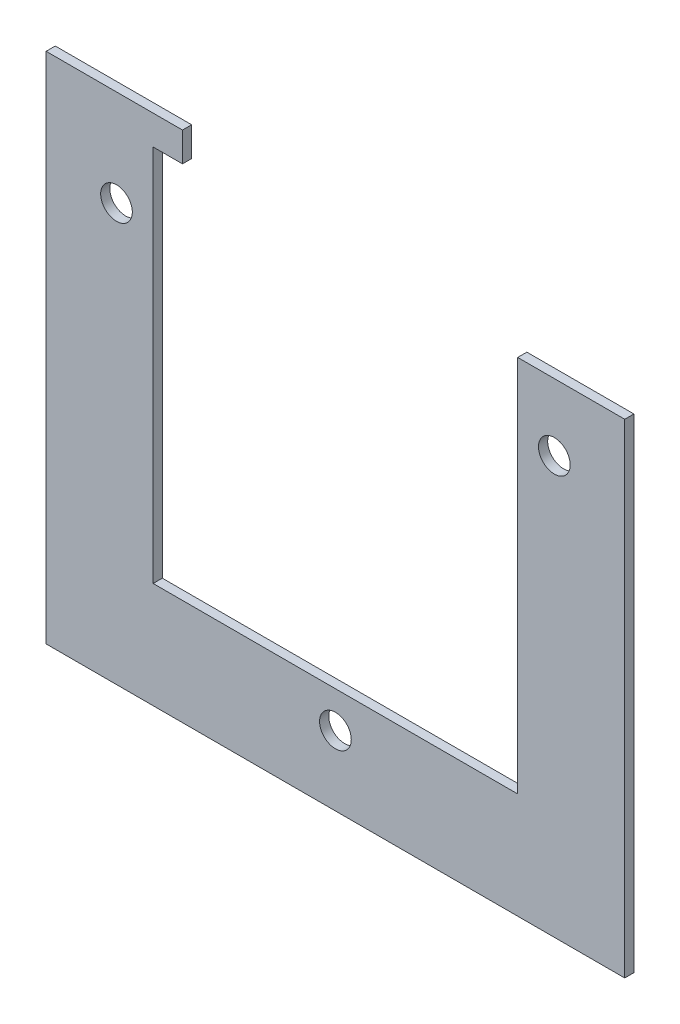
ISO-10303-21;
HEADER;
FILE_DESCRIPTION(('STEP AP214'),'2;1');
FILE_NAME('part.step','',(''),(''),'','','');
FILE_SCHEMA(('AUTOMOTIVE_DESIGN { 1 0 10303 214 1 1 1 1 }'));
ENDSEC;
DATA;
#1=APPLICATION_CONTEXT('core data for automotive mechanical design processes');
#2=APPLICATION_PROTOCOL_DEFINITION('international standard','automotive_design',2000,#1);
#3=PRODUCT_CONTEXT('',#1,'mechanical');
#4=PRODUCT('Part','Part','',(#3));
#5=PRODUCT_RELATED_PRODUCT_CATEGORY('part','',(#4));
#6=PRODUCT_DEFINITION_FORMATION('','',#4);
#7=PRODUCT_DEFINITION_CONTEXT('part definition',#1,'design');
#8=PRODUCT_DEFINITION('design','',#6,#7);
#9=PRODUCT_DEFINITION_SHAPE('','',#8);
#10=(LENGTH_UNIT() NAMED_UNIT(*) SI_UNIT(.MILLI.,.METRE.));
#11=(NAMED_UNIT(*) PLANE_ANGLE_UNIT() SI_UNIT($,.RADIAN.));
#12=(NAMED_UNIT(*) SI_UNIT($,.STERADIAN.) SOLID_ANGLE_UNIT());
#13=UNCERTAINTY_MEASURE_WITH_UNIT(LENGTH_MEASURE(1.E-05),#10,'distance_accuracy_value','');
#14=(GEOMETRIC_REPRESENTATION_CONTEXT(3) GLOBAL_UNCERTAINTY_ASSIGNED_CONTEXT((#13)) GLOBAL_UNIT_ASSIGNED_CONTEXT((#10,
#11,#12)) REPRESENTATION_CONTEXT('',''));
#15=CARTESIAN_POINT('',(0.,0.,0.));
#16=DIRECTION('',(0.,0.,1.));
#17=DIRECTION('',(1.,0.,0.));
#18=AXIS2_PLACEMENT_3D('',#15,#16,#17);
#19=CARTESIAN_POINT('',(0.,0.,-0.79375));
#20=DIRECTION('',(0.,0.,1.));
#21=DIRECTION('',(-1.,0.,0.));
#22=AXIS2_PLACEMENT_3D('',#19,#20,#21);
#23=PLANE('',#22);
#24=CARTESIAN_POINT('',(7523.2575610023,3421.82109597681,-0.79375));
#25=DIRECTION('',(0.,0.,1.));
#26=DIRECTION('',(1.,0.,0.));
#27=AXIS2_PLACEMENT_3D('',#24,#25,#26);
#28=CIRCLE('',#27,1.3715999999997);
#29=CARTESIAN_POINT('',(7524.6291610023,3421.82109597681,-0.79375));
#30=VERTEX_POINT('',#29);
#31=EDGE_CURVE('E362',#30,#30,#28,.T.);
#32=ORIENTED_EDGE('',*,*,#31,.T.);
#33=EDGE_LOOP('',(#32));
#34=FACE_BOUND('',#33,.T.);
#35=DIRECTION('',(0.,-1.,0.));
#36=VECTOR('',#35,1.);
#37=CARTESIAN_POINT('',(7520.0825610023,3427.61229597682,-0.79375));
#38=LINE('',#37,#36);
#39=CARTESIAN_POINT('',(7520.0825610023,3427.61229597682,-0.79375));
#40=VERTEX_POINT('',#39);
#41=CARTESIAN_POINT('',(7520.0825610023,3394.87169597682,-0.79375));
#42=VERTEX_POINT('',#41);
#43=EDGE_CURVE('E170',#40,#42,#38,.T.);
#44=ORIENTED_EDGE('',*,*,#43,.F.);
#45=DIRECTION('',(-1.,0.,0.));
#46=VECTOR('',#45,1.);
#47=CARTESIAN_POINT('',(7520.0825610023,3427.61229597682,-0.79375));
#48=LINE('',#47,#46);
#49=CARTESIAN_POINT('',(7529.3535610023,3427.61229597682,-0.79375));
#50=VERTEX_POINT('',#49);
#51=EDGE_CURVE('E138',#50,#40,#48,.T.);
#52=ORIENTED_EDGE('',*,*,#51,.F.);
#53=DIRECTION('',(0.,1.,0.));
#54=VECTOR('',#53,1.);
#55=CARTESIAN_POINT('',(7529.3535610023,3427.61229597682,-0.79375));
#56=LINE('',#55,#54);
#57=CARTESIAN_POINT('',(7529.3535610023,3385.70229597682,-0.79375));
#58=VERTEX_POINT('',#57);
#59=EDGE_CURVE('E119',#58,#50,#56,.T.);
#60=ORIENTED_EDGE('',*,*,#59,.F.);
#61=DIRECTION('',(1.,0.,0.));
#62=VECTOR('',#61,1.);
#63=CARTESIAN_POINT('',(7529.3535610023,3385.70229597682,-0.79375));
#64=LINE('',#63,#62);
#65=CARTESIAN_POINT('',(7479.2393610023,3385.70229597682,-0.79375));
#66=VERTEX_POINT('',#65);
#67=EDGE_CURVE('E129',#66,#58,#64,.T.);
#68=ORIENTED_EDGE('',*,*,#67,.F.);
#69=DIRECTION('',(0.,-1.,0.));
#70=VECTOR('',#69,1.);
#71=CARTESIAN_POINT('',(7479.2393610023,3430.15229597682,-0.79375));
#72=LINE('',#71,#70);
#73=CARTESIAN_POINT('',(7479.2393610023,3430.15229597682,-0.79375));
#74=VERTEX_POINT('',#73);
#75=EDGE_CURVE('E134',#74,#66,#72,.T.);
#76=ORIENTED_EDGE('',*,*,#75,.F.);
#77=DIRECTION('',(-1.,0.,0.));
#78=VECTOR('',#77,1.);
#79=CARTESIAN_POINT('',(7479.2393610023,3430.15229597682,-0.79375));
#80=LINE('',#79,#78);
#81=CARTESIAN_POINT('',(7491.0503610023,3430.15229597682,-0.79375));
#82=VERTEX_POINT('',#81);
#83=EDGE_CURVE('E206',#82,#74,#80,.T.);
#84=ORIENTED_EDGE('',*,*,#83,.F.);
#85=DIRECTION('',(0.,1.,0.));
#86=VECTOR('',#85,1.);
#87=CARTESIAN_POINT('',(7491.0503610023,3427.61229597682,-0.79375));
#88=LINE('',#87,#86);
#89=CARTESIAN_POINT('',(7491.0503610023,3427.61229597682,-0.79375));
#90=VERTEX_POINT('',#89);
#91=EDGE_CURVE('E203',#90,#82,#88,.T.);
#92=ORIENTED_EDGE('',*,*,#91,.F.);
#93=DIRECTION('',(1.,0.,0.));
#94=VECTOR('',#93,1.);
#95=CARTESIAN_POINT('',(7491.0503610023,3427.61229597682,-0.79375));
#96=LINE('',#95,#94);
#97=CARTESIAN_POINT('',(7488.5103610023,3427.61229597682,-0.79375));
#98=VERTEX_POINT('',#97);
#99=EDGE_CURVE('E200',#98,#90,#96,.T.);
#100=ORIENTED_EDGE('',*,*,#99,.F.);
#101=DIRECTION('',(0.,1.,0.));
#102=VECTOR('',#101,1.);
#103=CARTESIAN_POINT('',(7488.5103610023,3394.87169597682,-0.79375));
#104=LINE('',#103,#102);
#105=CARTESIAN_POINT('',(7488.5103610023,3394.87169597682,-0.79375));
#106=VERTEX_POINT('',#105);
#107=EDGE_CURVE('E193',#106,#98,#104,.T.);
#108=ORIENTED_EDGE('',*,*,#107,.F.);
#109=DIRECTION('',(-1.,0.,0.));
#110=VECTOR('',#109,1.);
#111=CARTESIAN_POINT('',(7520.0825610023,3394.87169597682,-0.79375));
#112=LINE('',#111,#110);
#113=EDGE_CURVE('E183',#42,#106,#112,.T.);
#114=ORIENTED_EDGE('',*,*,#113,.F.);
#115=EDGE_LOOP('',(#44,#52,#60,#68,#76,#84,#92,#100,#108,#114));
#116=FACE_BOUND('',#115,.T.);
#117=CARTESIAN_POINT('',(7504.2964610023,3391.73492355912,-0.79375));
#118=DIRECTION('',(0.,0.,1.));
#119=DIRECTION('',(1.,0.,0.));
#120=AXIS2_PLACEMENT_3D('',#117,#118,#119);
#121=CIRCLE('',#120,1.3715999999997);
#122=CARTESIAN_POINT('',(7505.6680610023,3391.73492355912,-0.79375));
#123=VERTEX_POINT('',#122);
#124=EDGE_CURVE('E147',#123,#123,#121,.T.);
#125=ORIENTED_EDGE('',*,*,#124,.T.);
#126=EDGE_LOOP('',(#125));
#127=FACE_BOUND('',#126,.T.);
#128=CARTESIAN_POINT('',(7485.3353610023,3421.82109597681,-0.79375));
#129=DIRECTION('',(0.,0.,1.));
#130=DIRECTION('',(1.,0.,0.));
#131=AXIS2_PLACEMENT_3D('',#128,#129,#130);
#132=CIRCLE('',#131,1.3715999999997);
#133=CARTESIAN_POINT('',(7486.7069610023,3421.82109597681,-0.79375));
#134=VERTEX_POINT('',#133);
#135=EDGE_CURVE('E353',#134,#134,#132,.T.);
#136=ORIENTED_EDGE('',*,*,#135,.T.);
#137=EDGE_LOOP('',(#136));
#138=FACE_BOUND('',#137,.T.);
#139=ADVANCED_FACE('F34',(#34,#116,#127,#138),#23,.F.);
#140=CARTESIAN_POINT('',(0.,0.,0.));
#141=DIRECTION('',(0.,0.,1.));
#142=DIRECTION('',(-1.,0.,0.));
#143=AXIS2_PLACEMENT_3D('',#140,#141,#142);
#144=PLANE('',#143);
#145=CARTESIAN_POINT('',(7523.2575610023,3421.82109597681,0.));
#146=DIRECTION('',(0.,0.,1.));
#147=DIRECTION('',(1.,0.,0.));
#148=AXIS2_PLACEMENT_3D('',#145,#146,#147);
#149=CIRCLE('',#148,1.3715999999997);
#150=CARTESIAN_POINT('',(7524.6291610023,3421.82109597681,0.));
#151=VERTEX_POINT('',#150);
#152=EDGE_CURVE('E359',#151,#151,#149,.T.);
#153=ORIENTED_EDGE('',*,*,#152,.F.);
#154=EDGE_LOOP('',(#153));
#155=FACE_BOUND('',#154,.T.);
#156=DIRECTION('',(0.,-1.,0.));
#157=VECTOR('',#156,1.);
#158=CARTESIAN_POINT('',(7520.0825610023,3427.61229597682,0.));
#159=LINE('',#158,#157);
#160=CARTESIAN_POINT('',(7520.0825610023,3427.61229597682,0.));
#161=VERTEX_POINT('',#160);
#162=CARTESIAN_POINT('',(7520.0825610023,3394.87169597682,0.));
#163=VERTEX_POINT('',#162);
#164=EDGE_CURVE('E143',#161,#163,#159,.T.);
#165=ORIENTED_EDGE('',*,*,#164,.T.);
#166=DIRECTION('',(-1.,0.,0.));
#167=VECTOR('',#166,1.);
#168=CARTESIAN_POINT('',(7520.0825610023,3394.87169597682,0.));
#169=LINE('',#168,#167);
#170=CARTESIAN_POINT('',(7488.5103610023,3394.87169597682,0.));
#171=VERTEX_POINT('',#170);
#172=EDGE_CURVE('E146',#163,#171,#169,.T.);
#173=ORIENTED_EDGE('',*,*,#172,.T.);
#174=DIRECTION('',(0.,1.,0.));
#175=VECTOR('',#174,1.);
#176=CARTESIAN_POINT('',(7488.5103610023,3394.87169597682,0.));
#177=LINE('',#176,#175);
#178=CARTESIAN_POINT('',(7488.5103610023,3427.61229597682,0.));
#179=VERTEX_POINT('',#178);
#180=EDGE_CURVE('E150',#171,#179,#177,.T.);
#181=ORIENTED_EDGE('',*,*,#180,.T.);
#182=DIRECTION('',(1.,0.,0.));
#183=VECTOR('',#182,1.);
#184=CARTESIAN_POINT('',(7491.0503610023,3427.61229597682,0.));
#185=LINE('',#184,#183);
#186=CARTESIAN_POINT('',(7491.0503610023,3427.61229597682,0.));
#187=VERTEX_POINT('',#186);
#188=EDGE_CURVE('E153',#179,#187,#185,.T.);
#189=ORIENTED_EDGE('',*,*,#188,.T.);
#190=DIRECTION('',(0.,1.,0.));
#191=VECTOR('',#190,1.);
#192=CARTESIAN_POINT('',(7491.0503610023,3427.61229597682,0.));
#193=LINE('',#192,#191);
#194=CARTESIAN_POINT('',(7491.0503610023,3430.15229597682,0.));
#195=VERTEX_POINT('',#194);
#196=EDGE_CURVE('E156',#187,#195,#193,.T.);
#197=ORIENTED_EDGE('',*,*,#196,.T.);
#198=DIRECTION('',(-1.,0.,0.));
#199=VECTOR('',#198,1.);
#200=CARTESIAN_POINT('',(7479.2393610023,3430.15229597682,0.));
#201=LINE('',#200,#199);
#202=CARTESIAN_POINT('',(7479.2393610023,3430.15229597682,0.));
#203=VERTEX_POINT('',#202);
#204=EDGE_CURVE('E159',#195,#203,#201,.T.);
#205=ORIENTED_EDGE('',*,*,#204,.T.);
#206=DIRECTION('',(0.,-1.,0.));
#207=VECTOR('',#206,1.);
#208=CARTESIAN_POINT('',(7479.2393610023,3430.15229597682,0.));
#209=LINE('',#208,#207);
#210=CARTESIAN_POINT('',(7479.2393610023,3385.70229597682,0.));
#211=VERTEX_POINT('',#210);
#212=EDGE_CURVE('E162',#203,#211,#209,.T.);
#213=ORIENTED_EDGE('',*,*,#212,.T.);
#214=DIRECTION('',(1.,0.,0.));
#215=VECTOR('',#214,1.);
#216=CARTESIAN_POINT('',(7529.3535610023,3385.70229597682,0.));
#217=LINE('',#216,#215);
#218=CARTESIAN_POINT('',(7529.3535610023,3385.70229597682,0.));
#219=VERTEX_POINT('',#218);
#220=EDGE_CURVE('E165',#211,#219,#217,.T.);
#221=ORIENTED_EDGE('',*,*,#220,.T.);
#222=DIRECTION('',(0.,1.,0.));
#223=VECTOR('',#222,1.);
#224=CARTESIAN_POINT('',(7529.3535610023,3427.61229597682,0.));
#225=LINE('',#224,#223);
#226=CARTESIAN_POINT('',(7529.3535610023,3427.61229597682,0.));
#227=VERTEX_POINT('',#226);
#228=EDGE_CURVE('E122',#219,#227,#225,.T.);
#229=ORIENTED_EDGE('',*,*,#228,.T.);
#230=DIRECTION('',(-1.,0.,0.));
#231=VECTOR('',#230,1.);
#232=CARTESIAN_POINT('',(7520.0825610023,3427.61229597682,0.));
#233=LINE('',#232,#231);
#234=EDGE_CURVE('E168',#227,#161,#233,.T.);
#235=ORIENTED_EDGE('',*,*,#234,.T.);
#236=EDGE_LOOP('',(#165,#173,#181,#189,#197,#205,#213,#221,#229,#235));
#237=FACE_BOUND('',#236,.T.);
#238=CARTESIAN_POINT('',(7504.2964610023,3391.73492355912,0.));
#239=DIRECTION('',(0.,0.,1.));
#240=DIRECTION('',(1.,0.,0.));
#241=AXIS2_PLACEMENT_3D('',#238,#239,#240);
#242=CIRCLE('',#241,1.3715999999997);
#243=CARTESIAN_POINT('',(7505.6680610023,3391.73492355912,0.));
#244=VERTEX_POINT('',#243);
#245=EDGE_CURVE('E196',#244,#244,#242,.T.);
#246=ORIENTED_EDGE('',*,*,#245,.F.);
#247=EDGE_LOOP('',(#246));
#248=FACE_BOUND('',#247,.T.);
#249=CARTESIAN_POINT('',(7485.3353610023,3421.82109597681,0.));
#250=DIRECTION('',(0.,0.,1.));
#251=DIRECTION('',(1.,0.,0.));
#252=AXIS2_PLACEMENT_3D('',#249,#250,#251);
#253=CIRCLE('',#252,1.3715999999997);
#254=CARTESIAN_POINT('',(7486.7069610023,3421.82109597681,0.));
#255=VERTEX_POINT('',#254);
#256=EDGE_CURVE('E356',#255,#255,#253,.T.);
#257=ORIENTED_EDGE('',*,*,#256,.F.);
#258=EDGE_LOOP('',(#257));
#259=FACE_BOUND('',#258,.T.);
#260=ADVANCED_FACE('F190',(#155,#237,#248,#259),#144,.T.);
#261=CARTESIAN_POINT('',(7520.0825610023,3427.61229597682,-0.79375));
#262=DIRECTION('',(1.,0.,0.));
#263=DIRECTION('',(0.,0.,1.));
#264=AXIS2_PLACEMENT_3D('',#261,#262,#263);
#265=PLANE('',#264);
#266=ORIENTED_EDGE('',*,*,#164,.F.);
#267=DIRECTION('',(0.,0.,1.));
#268=VECTOR('',#267,1.);
#269=CARTESIAN_POINT('',(7520.0825610023,3427.61229597682,-0.79375));
#270=LINE('',#269,#268);
#271=EDGE_CURVE('E51',#40,#161,#270,.T.);
#272=ORIENTED_EDGE('',*,*,#271,.F.);
#273=ORIENTED_EDGE('',*,*,#43,.T.);
#274=DIRECTION('',(0.,0.,1.));
#275=VECTOR('',#274,1.);
#276=CARTESIAN_POINT('',(7520.0825610023,3394.87169597682,-0.79375));
#277=LINE('',#276,#275);
#278=EDGE_CURVE('E11',#42,#163,#277,.T.);
#279=ORIENTED_EDGE('',*,*,#278,.T.);
#280=EDGE_LOOP('',(#266,#272,#273,#279));
#281=FACE_BOUND('',#280,.T.);
#282=ADVANCED_FACE('F36',(#281),#265,.F.);
#283=CARTESIAN_POINT('',(7520.0825610023,3394.87169597682,-0.79375));
#284=DIRECTION('',(0.,-1.,0.));
#285=DIRECTION('',(0.,0.,1.));
#286=AXIS2_PLACEMENT_3D('',#283,#284,#285);
#287=PLANE('',#286);
#288=ORIENTED_EDGE('',*,*,#172,.F.);
#289=ORIENTED_EDGE('',*,*,#278,.F.);
#290=ORIENTED_EDGE('',*,*,#113,.T.);
#291=DIRECTION('',(0.,0.,1.));
#292=VECTOR('',#291,1.);
#293=CARTESIAN_POINT('',(7488.5103610023,3394.87169597682,-0.79375));
#294=LINE('',#293,#292);
#295=EDGE_CURVE('E43',#106,#171,#294,.T.);
#296=ORIENTED_EDGE('',*,*,#295,.T.);
#297=EDGE_LOOP('',(#288,#289,#290,#296));
#298=FACE_BOUND('',#297,.T.);
#299=ADVANCED_FACE('F182',(#298),#287,.F.);
#300=CARTESIAN_POINT('',(7488.5103610023,3394.87169597682,-0.79375));
#301=DIRECTION('',(-1.,0.,0.));
#302=DIRECTION('',(0.,0.,-1.));
#303=AXIS2_PLACEMENT_3D('',#300,#301,#302);
#304=PLANE('',#303);
#305=ORIENTED_EDGE('',*,*,#180,.F.);
#306=ORIENTED_EDGE('',*,*,#295,.F.);
#307=ORIENTED_EDGE('',*,*,#107,.T.);
#308=DIRECTION('',(0.,0.,1.));
#309=VECTOR('',#308,1.);
#310=CARTESIAN_POINT('',(7488.5103610023,3427.61229597682,-0.79375));
#311=LINE('',#310,#309);
#312=EDGE_CURVE('E180',#98,#179,#311,.T.);
#313=ORIENTED_EDGE('',*,*,#312,.T.);
#314=EDGE_LOOP('',(#305,#306,#307,#313));
#315=FACE_BOUND('',#314,.T.);
#316=ADVANCED_FACE('F187',(#315),#304,.F.);
#317=CARTESIAN_POINT('',(7491.0503610023,3427.61229597682,-0.79375));
#318=DIRECTION('',(0.,1.,0.));
#319=DIRECTION('',(0.,0.,-1.));
#320=AXIS2_PLACEMENT_3D('',#317,#318,#319);
#321=PLANE('',#320);
#322=ORIENTED_EDGE('',*,*,#188,.F.);
#323=ORIENTED_EDGE('',*,*,#312,.F.);
#324=ORIENTED_EDGE('',*,*,#99,.T.);
#325=DIRECTION('',(0.,0.,1.));
#326=VECTOR('',#325,1.);
#327=CARTESIAN_POINT('',(7491.0503610023,3427.61229597682,-0.79375));
#328=LINE('',#327,#326);
#329=EDGE_CURVE('E178',#90,#187,#328,.T.);
#330=ORIENTED_EDGE('',*,*,#329,.T.);
#331=EDGE_LOOP('',(#322,#323,#324,#330));
#332=FACE_BOUND('',#331,.T.);
#333=ADVANCED_FACE('F221',(#332),#321,.F.);
#334=CARTESIAN_POINT('',(7491.0503610023,3427.61229597682,-0.79375));
#335=DIRECTION('',(-1.,0.,0.));
#336=DIRECTION('',(0.,0.,-1.));
#337=AXIS2_PLACEMENT_3D('',#334,#335,#336);
#338=PLANE('',#337);
#339=ORIENTED_EDGE('',*,*,#196,.F.);
#340=ORIENTED_EDGE('',*,*,#329,.F.);
#341=ORIENTED_EDGE('',*,*,#91,.T.);
#342=DIRECTION('',(0.,0.,1.));
#343=VECTOR('',#342,1.);
#344=CARTESIAN_POINT('',(7491.0503610023,3430.15229597682,-0.79375));
#345=LINE('',#344,#343);
#346=EDGE_CURVE('E176',#82,#195,#345,.T.);
#347=ORIENTED_EDGE('',*,*,#346,.T.);
#348=EDGE_LOOP('',(#339,#340,#341,#347));
#349=FACE_BOUND('',#348,.T.);
#350=ADVANCED_FACE('F219',(#349),#338,.F.);
#351=CARTESIAN_POINT('',(7479.2393610023,3430.15229597682,-0.79375));
#352=DIRECTION('',(0.,-1.,0.));
#353=DIRECTION('',(0.,0.,1.));
#354=AXIS2_PLACEMENT_3D('',#351,#352,#353);
#355=PLANE('',#354);
#356=ORIENTED_EDGE('',*,*,#204,.F.);
#357=ORIENTED_EDGE('',*,*,#346,.F.);
#358=ORIENTED_EDGE('',*,*,#83,.T.);
#359=DIRECTION('',(0.,0.,1.));
#360=VECTOR('',#359,1.);
#361=CARTESIAN_POINT('',(7479.2393610023,3430.15229597682,-0.79375));
#362=LINE('',#361,#360);
#363=EDGE_CURVE('E174',#74,#203,#362,.T.);
#364=ORIENTED_EDGE('',*,*,#363,.T.);
#365=EDGE_LOOP('',(#356,#357,#358,#364));
#366=FACE_BOUND('',#365,.T.);
#367=ADVANCED_FACE('F216',(#366),#355,.F.);
#368=CARTESIAN_POINT('',(7479.2393610023,3430.15229597682,-0.79375));
#369=DIRECTION('',(1.,0.,0.));
#370=DIRECTION('',(0.,0.,1.));
#371=AXIS2_PLACEMENT_3D('',#368,#369,#370);
#372=PLANE('',#371);
#373=ORIENTED_EDGE('',*,*,#212,.F.);
#374=ORIENTED_EDGE('',*,*,#363,.F.);
#375=ORIENTED_EDGE('',*,*,#75,.T.);
#376=DIRECTION('',(0.,0.,1.));
#377=VECTOR('',#376,1.);
#378=CARTESIAN_POINT('',(7479.2393610023,3385.70229597682,-0.79375));
#379=LINE('',#378,#377);
#380=EDGE_CURVE('E126',#66,#211,#379,.T.);
#381=ORIENTED_EDGE('',*,*,#380,.T.);
#382=EDGE_LOOP('',(#373,#374,#375,#381));
#383=FACE_BOUND('',#382,.T.);
#384=ADVANCED_FACE('F210',(#383),#372,.F.);
#385=CARTESIAN_POINT('',(7529.3535610023,3385.70229597682,-0.79375));
#386=DIRECTION('',(0.,1.,0.));
#387=DIRECTION('',(0.,0.,-1.));
#388=AXIS2_PLACEMENT_3D('',#385,#386,#387);
#389=PLANE('',#388);
#390=ORIENTED_EDGE('',*,*,#220,.F.);
#391=ORIENTED_EDGE('',*,*,#380,.F.);
#392=ORIENTED_EDGE('',*,*,#67,.T.);
#393=DIRECTION('',(0.,0.,1.));
#394=VECTOR('',#393,1.);
#395=CARTESIAN_POINT('',(7529.3535610023,3385.70229597682,-0.79375));
#396=LINE('',#395,#394);
#397=EDGE_CURVE('E115',#58,#219,#396,.T.);
#398=ORIENTED_EDGE('',*,*,#397,.T.);
#399=EDGE_LOOP('',(#390,#391,#392,#398));
#400=FACE_BOUND('',#399,.T.);
#401=ADVANCED_FACE('F130',(#400),#389,.F.);
#402=CARTESIAN_POINT('',(7529.3535610023,3427.61229597682,-0.79375));
#403=DIRECTION('',(-1.,0.,0.));
#404=DIRECTION('',(0.,0.,-1.));
#405=AXIS2_PLACEMENT_3D('',#402,#403,#404);
#406=PLANE('',#405);
#407=ORIENTED_EDGE('',*,*,#228,.F.);
#408=ORIENTED_EDGE('',*,*,#397,.F.);
#409=ORIENTED_EDGE('',*,*,#59,.T.);
#410=DIRECTION('',(0.,0.,1.));
#411=VECTOR('',#410,1.);
#412=CARTESIAN_POINT('',(7529.3535610023,3427.61229597682,-0.79375));
#413=LINE('',#412,#411);
#414=EDGE_CURVE('E85',#50,#227,#413,.T.);
#415=ORIENTED_EDGE('',*,*,#414,.T.);
#416=EDGE_LOOP('',(#407,#408,#409,#415));
#417=FACE_BOUND('',#416,.T.);
#418=ADVANCED_FACE('F117',(#417),#406,.F.);
#419=CARTESIAN_POINT('',(7520.0825610023,3427.61229597682,-0.79375));
#420=DIRECTION('',(0.,-1.,0.));
#421=DIRECTION('',(0.,0.,1.));
#422=AXIS2_PLACEMENT_3D('',#419,#420,#421);
#423=PLANE('',#422);
#424=ORIENTED_EDGE('',*,*,#234,.F.);
#425=ORIENTED_EDGE('',*,*,#414,.F.);
#426=ORIENTED_EDGE('',*,*,#51,.T.);
#427=ORIENTED_EDGE('',*,*,#271,.T.);
#428=EDGE_LOOP('',(#424,#425,#426,#427));
#429=FACE_BOUND('',#428,.T.);
#430=ADVANCED_FACE('F243',(#429),#423,.F.);
#431=CARTESIAN_POINT('',(7504.2964610023,3391.73492355912,-0.79375));
#432=DIRECTION('',(0.,0.,1.));
#433=DIRECTION('',(-1.,0.,0.));
#434=AXIS2_PLACEMENT_3D('',#431,#432,#433);
#435=CYLINDRICAL_SURFACE('',#434,1.3715999999997);
#436=ORIENTED_EDGE('',*,*,#124,.F.);
#437=EDGE_LOOP('',(#436));
#438=FACE_BOUND('',#437,.T.);
#439=ORIENTED_EDGE('',*,*,#245,.T.);
#440=EDGE_LOOP('',(#439));
#441=FACE_BOUND('',#440,.T.);
#442=ADVANCED_FACE('F240',(#438,#441),#435,.F.);
#443=CARTESIAN_POINT('',(7523.2575610023,3421.82109597681,-0.79375));
#444=DIRECTION('',(0.,0.,1.));
#445=DIRECTION('',(-1.,0.,0.));
#446=AXIS2_PLACEMENT_3D('',#443,#444,#445);
#447=CYLINDRICAL_SURFACE('',#446,1.3715999999997);
#448=ORIENTED_EDGE('',*,*,#31,.F.);
#449=EDGE_LOOP('',(#448));
#450=FACE_BOUND('',#449,.T.);
#451=ORIENTED_EDGE('',*,*,#152,.T.);
#452=EDGE_LOOP('',(#451));
#453=FACE_BOUND('',#452,.T.);
#454=ADVANCED_FACE('F279',(#450,#453),#447,.F.);
#455=CARTESIAN_POINT('',(7485.3353610023,3421.82109597681,-0.79375));
#456=DIRECTION('',(0.,0.,1.));
#457=DIRECTION('',(-1.,0.,0.));
#458=AXIS2_PLACEMENT_3D('',#455,#456,#457);
#459=CYLINDRICAL_SURFACE('',#458,1.3715999999997);
#460=ORIENTED_EDGE('',*,*,#135,.F.);
#461=EDGE_LOOP('',(#460));
#462=FACE_BOUND('',#461,.T.);
#463=ORIENTED_EDGE('',*,*,#256,.T.);
#464=EDGE_LOOP('',(#463));
#465=FACE_BOUND('',#464,.T.);
#466=ADVANCED_FACE('F286',(#462,#465),#459,.F.);
#467=CLOSED_SHELL('',(#139,#260,#282,#299,#316,#333,#350,#367,#384,#401,#418,#430,#442,#454,#466));
#468=MANIFOLD_SOLID_BREP('B2',#467);
#469=ADVANCED_BREP_SHAPE_REPRESENTATION('',(#18,#468),#14);
#470=SHAPE_DEFINITION_REPRESENTATION(#9,#469);
ENDSEC;
END-ISO-10303-21;
